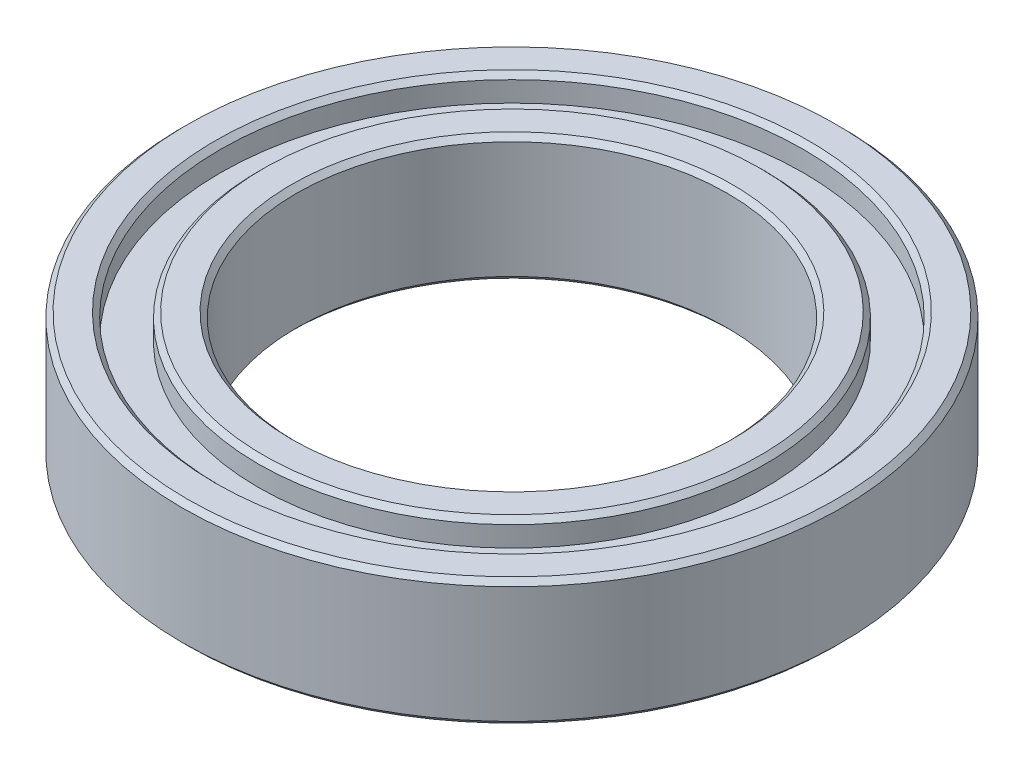
ISO-10303-21;
HEADER;
FILE_DESCRIPTION(('STEP AP214'),'2;1');
FILE_NAME('part.step','',(''),(''),'','','');
FILE_SCHEMA(('AUTOMOTIVE_DESIGN { 1 0 10303 214 1 1 1 1 }'));
ENDSEC;
DATA;
#1=APPLICATION_CONTEXT('core data for automotive mechanical design processes');
#2=APPLICATION_PROTOCOL_DEFINITION('international standard','automotive_design',2000,#1);
#3=PRODUCT_CONTEXT('',#1,'mechanical');
#4=PRODUCT('Part','Part','',(#3));
#5=PRODUCT_RELATED_PRODUCT_CATEGORY('part','',(#4));
#6=PRODUCT_DEFINITION_FORMATION('','',#4);
#7=PRODUCT_DEFINITION_CONTEXT('part definition',#1,'design');
#8=PRODUCT_DEFINITION('design','',#6,#7);
#9=PRODUCT_DEFINITION_SHAPE('','',#8);
#10=(LENGTH_UNIT() NAMED_UNIT(*) SI_UNIT(.MILLI.,.METRE.));
#11=(NAMED_UNIT(*) PLANE_ANGLE_UNIT() SI_UNIT($,.RADIAN.));
#12=(NAMED_UNIT(*) SI_UNIT($,.STERADIAN.) SOLID_ANGLE_UNIT());
#13=UNCERTAINTY_MEASURE_WITH_UNIT(LENGTH_MEASURE(1.E-05),#10,'distance_accuracy_value','');
#14=(GEOMETRIC_REPRESENTATION_CONTEXT(3) GLOBAL_UNCERTAINTY_ASSIGNED_CONTEXT((#13)) GLOBAL_UNIT_ASSIGNED_CONTEXT((#10,
#11,#12)) REPRESENTATION_CONTEXT('',''));
#15=CARTESIAN_POINT('',(0.,0.,0.));
#16=DIRECTION('',(0.,0.,1.));
#17=DIRECTION('',(1.,0.,0.));
#18=AXIS2_PLACEMENT_3D('',#15,#16,#17);
#19=CARTESIAN_POINT('',(0.,0.,0.));
#20=DIRECTION('',(0.,1.,0.));
#21=DIRECTION('',(0.,0.,1.));
#22=AXIS2_PLACEMENT_3D('',#19,#20,#21);
#23=PLANE('',#22);
#24=CARTESIAN_POINT('',(0.,0.,0.));
#25=DIRECTION('',(0.,1.,0.));
#26=DIRECTION('',(0.,0.,1.));
#27=AXIS2_PLACEMENT_3D('',#24,#25,#26);
#28=CIRCLE('',#27,9.80000000000001);
#29=CARTESIAN_POINT('',(0.,0.,9.80000000000001));
#30=VERTEX_POINT('',#29);
#31=EDGE_CURVE('E55',#30,#30,#28,.F.);
#32=ORIENTED_EDGE('',*,*,#31,.T.);
#33=EDGE_LOOP('',(#32));
#34=FACE_BOUND('',#33,.T.);
#35=CARTESIAN_POINT('',(0.,0.,0.));
#36=DIRECTION('',(0.,1.,0.));
#37=DIRECTION('',(0.,0.,1.));
#38=AXIS2_PLACEMENT_3D('',#35,#36,#37);
#39=CIRCLE('',#38,8.7);
#40=CARTESIAN_POINT('',(0.,0.,8.7));
#41=VERTEX_POINT('',#40);
#42=EDGE_CURVE('E59',#41,#41,#39,.T.);
#43=ORIENTED_EDGE('',*,*,#42,.T.);
#44=EDGE_LOOP('',(#43));
#45=FACE_BOUND('',#44,.T.);
#46=ADVANCED_FACE('F47',(#34,#45),#23,.F.);
#47=CARTESIAN_POINT('',(0.,5.,0.));
#48=DIRECTION('',(0.,1.,0.));
#49=DIRECTION('',(0.,0.,1.));
#50=AXIS2_PLACEMENT_3D('',#47,#48,#49);
#51=PLANE('',#50);
#52=CARTESIAN_POINT('',(0.,5.,0.));
#53=DIRECTION('',(0.,1.,0.));
#54=DIRECTION('',(0.,0.,1.));
#55=AXIS2_PLACEMENT_3D('',#52,#53,#54);
#56=CIRCLE('',#55,9.8);
#57=CARTESIAN_POINT('',(0.,5.,-9.8));
#58=VERTEX_POINT('',#57);
#59=EDGE_CURVE('E98',#58,#58,#56,.T.);
#60=ORIENTED_EDGE('',*,*,#59,.T.);
#61=EDGE_LOOP('',(#60));
#62=FACE_BOUND('',#61,.T.);
#63=CARTESIAN_POINT('',(0.,5.,0.));
#64=DIRECTION('',(0.,1.,0.));
#65=DIRECTION('',(0.,0.,1.));
#66=AXIS2_PLACEMENT_3D('',#63,#64,#65);
#67=CIRCLE('',#66,8.70000000000001);
#68=CARTESIAN_POINT('',(0.,5.,8.70000000000001));
#69=VERTEX_POINT('',#68);
#70=EDGE_CURVE('E101',#69,#69,#67,.F.);
#71=ORIENTED_EDGE('',*,*,#70,.T.);
#72=EDGE_LOOP('',(#71));
#73=FACE_BOUND('',#72,.T.);
#74=ADVANCED_FACE('F138',(#62,#73),#51,.T.);
#75=CARTESIAN_POINT('',(0.,5.,0.));
#76=DIRECTION('',(0.,1.,0.));
#77=DIRECTION('',(0.,0.,1.));
#78=AXIS2_PLACEMENT_3D('',#75,#76,#77);
#79=CIRCLE('',#78,12.8);
#80=CARTESIAN_POINT('',(0.,5.,12.8));
#81=VERTEX_POINT('',#80);
#82=EDGE_CURVE('E83',#81,#81,#79,.T.);
#83=ORIENTED_EDGE('',*,*,#82,.T.);
#84=EDGE_LOOP('',(#83));
#85=FACE_BOUND('',#84,.T.);
#86=CARTESIAN_POINT('',(0.,5.,0.));
#87=DIRECTION('',(0.,1.,0.));
#88=DIRECTION('',(0.,0.,1.));
#89=AXIS2_PLACEMENT_3D('',#86,#87,#88);
#90=CIRCLE('',#89,11.7);
#91=CARTESIAN_POINT('',(0.,5.,11.7));
#92=VERTEX_POINT('',#91);
#93=EDGE_CURVE('E86',#92,#92,#90,.F.);
#94=ORIENTED_EDGE('',*,*,#93,.T.);
#95=EDGE_LOOP('',(#94));
#96=FACE_BOUND('',#95,.T.);
#97=ADVANCED_FACE('F144',(#85,#96),#51,.T.);
#98=CARTESIAN_POINT('',(0.,0.,0.));
#99=DIRECTION('',(0.,1.,0.));
#100=DIRECTION('',(0.,0.,1.));
#101=AXIS2_PLACEMENT_3D('',#98,#99,#100);
#102=CIRCLE('',#101,12.8);
#103=CARTESIAN_POINT('',(0.,0.,12.8));
#104=VERTEX_POINT('',#103);
#105=EDGE_CURVE('E68',#104,#104,#102,.F.);
#106=ORIENTED_EDGE('',*,*,#105,.T.);
#107=EDGE_LOOP('',(#106));
#108=FACE_BOUND('',#107,.T.);
#109=CARTESIAN_POINT('',(0.,0.,0.));
#110=DIRECTION('',(0.,1.,0.));
#111=DIRECTION('',(0.,0.,1.));
#112=AXIS2_PLACEMENT_3D('',#109,#110,#111);
#113=CIRCLE('',#112,11.7);
#114=CARTESIAN_POINT('',(0.,0.,11.7));
#115=VERTEX_POINT('',#114);
#116=EDGE_CURVE('E71',#115,#115,#113,.T.);
#117=ORIENTED_EDGE('',*,*,#116,.T.);
#118=EDGE_LOOP('',(#117));
#119=FACE_BOUND('',#118,.T.);
#120=ADVANCED_FACE('F140',(#108,#119),#23,.F.);
#121=CARTESIAN_POINT('',(0.,5.,0.));
#122=DIRECTION('',(0.,-1.,0.));
#123=DIRECTION('',(0.,0.,-1.));
#124=AXIS2_PLACEMENT_3D('',#121,#122,#123);
#125=CYLINDRICAL_SURFACE('',#124,13.);
#126=CARTESIAN_POINT('',(0.,4.8,0.));
#127=DIRECTION('',(0.,1.,0.));
#128=DIRECTION('',(0.,0.,1.));
#129=AXIS2_PLACEMENT_3D('',#126,#127,#128);
#130=CIRCLE('',#129,13.);
#131=CARTESIAN_POINT('',(0.,4.8,13.));
#132=VERTEX_POINT('',#131);
#133=EDGE_CURVE('E77',#132,#132,#130,.F.);
#134=ORIENTED_EDGE('',*,*,#133,.T.);
#135=EDGE_LOOP('',(#134));
#136=FACE_BOUND('',#135,.T.);
#137=CARTESIAN_POINT('',(0.,0.199999999999997,0.));
#138=DIRECTION('',(0.,1.,0.));
#139=DIRECTION('',(0.,0.,1.));
#140=AXIS2_PLACEMENT_3D('',#137,#138,#139);
#141=CIRCLE('',#140,13.);
#142=CARTESIAN_POINT('',(0.,0.199999999999997,13.));
#143=VERTEX_POINT('',#142);
#144=EDGE_CURVE('E80',#143,#143,#141,.T.);
#145=ORIENTED_EDGE('',*,*,#144,.T.);
#146=EDGE_LOOP('',(#145));
#147=FACE_BOUND('',#146,.T.);
#148=ADVANCED_FACE('F150',(#136,#147),#125,.T.);
#149=CARTESIAN_POINT('',(0.,5.,0.));
#150=DIRECTION('',(0.,-1.,0.));
#151=DIRECTION('',(0.,0.,-1.));
#152=AXIS2_PLACEMENT_3D('',#149,#150,#151);
#153=CYLINDRICAL_SURFACE('',#152,8.5);
#154=CARTESIAN_POINT('',(0.,4.79999999999999,0.));
#155=DIRECTION('',(0.,1.,0.));
#156=DIRECTION('',(0.,0.,1.));
#157=AXIS2_PLACEMENT_3D('',#154,#155,#156);
#158=CIRCLE('',#157,8.5);
#159=CARTESIAN_POINT('',(0.,4.79999999999999,8.5));
#160=VERTEX_POINT('',#159);
#161=EDGE_CURVE('E89',#160,#160,#158,.T.);
#162=ORIENTED_EDGE('',*,*,#161,.T.);
#163=EDGE_LOOP('',(#162));
#164=FACE_BOUND('',#163,.T.);
#165=CARTESIAN_POINT('',(0.,0.200000000000001,0.));
#166=DIRECTION('',(0.,1.,0.));
#167=DIRECTION('',(0.,0.,1.));
#168=AXIS2_PLACEMENT_3D('',#165,#166,#167);
#169=CIRCLE('',#168,8.5);
#170=CARTESIAN_POINT('',(0.,0.200000000000001,8.5));
#171=VERTEX_POINT('',#170);
#172=EDGE_CURVE('E92',#171,#171,#169,.F.);
#173=ORIENTED_EDGE('',*,*,#172,.T.);
#174=EDGE_LOOP('',(#173));
#175=FACE_BOUND('',#174,.T.);
#176=ADVANCED_FACE('F156',(#164,#175),#153,.F.);
#177=CARTESIAN_POINT('',(0.,4.,0.));
#178=DIRECTION('',(0.,1.,0.));
#179=DIRECTION('',(0.,0.,1.));
#180=AXIS2_PLACEMENT_3D('',#177,#178,#179);
#181=CYLINDRICAL_SURFACE('',#180,11.5);
#182=CARTESIAN_POINT('',(0.,4.8,0.));
#183=DIRECTION('',(0.,1.,0.));
#184=DIRECTION('',(0.,0.,1.));
#185=AXIS2_PLACEMENT_3D('',#182,#183,#184);
#186=CIRCLE('',#185,11.5);
#187=CARTESIAN_POINT('',(0.,4.8,11.5));
#188=VERTEX_POINT('',#187);
#189=EDGE_CURVE('E74',#188,#188,#186,.T.);
#190=ORIENTED_EDGE('',*,*,#189,.T.);
#191=EDGE_LOOP('',(#190));
#192=FACE_BOUND('',#191,.T.);
#193=CARTESIAN_POINT('',(0.,4.,0.));
#194=DIRECTION('',(0.,1.,0.));
#195=DIRECTION('',(0.,0.,1.));
#196=AXIS2_PLACEMENT_3D('',#193,#194,#195);
#197=CIRCLE('',#196,11.5);
#198=CARTESIAN_POINT('',(0.,4.,11.5));
#199=VERTEX_POINT('',#198);
#200=EDGE_CURVE('E104',#199,#199,#197,.T.);
#201=ORIENTED_EDGE('',*,*,#200,.F.);
#202=EDGE_LOOP('',(#201));
#203=FACE_BOUND('',#202,.T.);
#204=ADVANCED_FACE('F229',(#192,#203),#181,.F.);
#205=CARTESIAN_POINT('',(0.,4.,0.));
#206=DIRECTION('',(0.,1.,0.));
#207=DIRECTION('',(0.,0.,1.));
#208=AXIS2_PLACEMENT_3D('',#205,#206,#207);
#209=PLANE('',#208);
#210=CARTESIAN_POINT('',(0.,4.,0.));
#211=DIRECTION('',(0.,1.,0.));
#212=DIRECTION('',(0.,0.,1.));
#213=AXIS2_PLACEMENT_3D('',#210,#211,#212);
#214=CIRCLE('',#213,10.);
#215=CARTESIAN_POINT('',(0.,4.,10.));
#216=VERTEX_POINT('',#215);
#217=EDGE_CURVE('E107',#216,#216,#214,.T.);
#218=ORIENTED_EDGE('',*,*,#217,.F.);
#219=EDGE_LOOP('',(#218));
#220=FACE_BOUND('',#219,.T.);
#221=ORIENTED_EDGE('',*,*,#200,.T.);
#222=EDGE_LOOP('',(#221));
#223=FACE_BOUND('',#222,.T.);
#224=ADVANCED_FACE('F134',(#220,#223),#209,.T.);
#225=CARTESIAN_POINT('',(0.,4.,0.));
#226=DIRECTION('',(0.,1.,0.));
#227=DIRECTION('',(0.,0.,1.));
#228=AXIS2_PLACEMENT_3D('',#225,#226,#227);
#229=CYLINDRICAL_SURFACE('',#228,10.);
#230=CARTESIAN_POINT('',(0.,4.80000000000001,0.));
#231=DIRECTION('',(0.,1.,0.));
#232=DIRECTION('',(0.,0.,1.));
#233=AXIS2_PLACEMENT_3D('',#230,#231,#232);
#234=CIRCLE('',#233,10.);
#235=CARTESIAN_POINT('',(0.,4.80000000000001,-10.));
#236=VERTEX_POINT('',#235);
#237=EDGE_CURVE('E95',#236,#236,#234,.F.);
#238=ORIENTED_EDGE('',*,*,#237,.T.);
#239=EDGE_LOOP('',(#238));
#240=FACE_BOUND('',#239,.T.);
#241=ORIENTED_EDGE('',*,*,#217,.T.);
#242=EDGE_LOOP('',(#241));
#243=FACE_BOUND('',#242,.T.);
#244=ADVANCED_FACE('F127',(#240,#243),#229,.T.);
#245=CARTESIAN_POINT('',(0.,1.,0.));
#246=DIRECTION('',(0.,-1.,0.));
#247=DIRECTION('',(0.,0.,-1.));
#248=AXIS2_PLACEMENT_3D('',#245,#246,#247);
#249=CYLINDRICAL_SURFACE('',#248,11.5);
#250=CARTESIAN_POINT('',(0.,0.200000000000001,0.));
#251=DIRECTION('',(0.,1.,0.));
#252=DIRECTION('',(0.,0.,1.));
#253=AXIS2_PLACEMENT_3D('',#250,#251,#252);
#254=CIRCLE('',#253,11.5);
#255=CARTESIAN_POINT('',(0.,0.200000000000001,11.5));
#256=VERTEX_POINT('',#255);
#257=EDGE_CURVE('E63',#256,#256,#254,.F.);
#258=ORIENTED_EDGE('',*,*,#257,.T.);
#259=EDGE_LOOP('',(#258));
#260=FACE_BOUND('',#259,.T.);
#261=CARTESIAN_POINT('',(0.,1.,0.));
#262=DIRECTION('',(0.,-1.,0.));
#263=DIRECTION('',(0.,0.,-1.));
#264=AXIS2_PLACEMENT_3D('',#261,#262,#263);
#265=CIRCLE('',#264,11.5);
#266=CARTESIAN_POINT('',(0.,1.,-11.5));
#267=VERTEX_POINT('',#266);
#268=EDGE_CURVE('E110',#267,#267,#265,.T.);
#269=ORIENTED_EDGE('',*,*,#268,.F.);
#270=EDGE_LOOP('',(#269));
#271=FACE_BOUND('',#270,.T.);
#272=ADVANCED_FACE('F122',(#260,#271),#249,.F.);
#273=CARTESIAN_POINT('',(0.,1.,0.));
#274=DIRECTION('',(0.,-1.,0.));
#275=DIRECTION('',(0.,0.,-1.));
#276=AXIS2_PLACEMENT_3D('',#273,#274,#275);
#277=PLANE('',#276);
#278=CARTESIAN_POINT('',(0.,1.,0.));
#279=DIRECTION('',(0.,-1.,0.));
#280=DIRECTION('',(0.,0.,-1.));
#281=AXIS2_PLACEMENT_3D('',#278,#279,#280);
#282=CIRCLE('',#281,10.);
#283=CARTESIAN_POINT('',(0.,1.,-10.));
#284=VERTEX_POINT('',#283);
#285=EDGE_CURVE('E113',#284,#284,#282,.T.);
#286=ORIENTED_EDGE('',*,*,#285,.F.);
#287=EDGE_LOOP('',(#286));
#288=FACE_BOUND('',#287,.T.);
#289=ORIENTED_EDGE('',*,*,#268,.T.);
#290=EDGE_LOOP('',(#289));
#291=FACE_BOUND('',#290,.T.);
#292=ADVANCED_FACE('F119',(#288,#291),#277,.T.);
#293=CARTESIAN_POINT('',(0.,1.,0.));
#294=DIRECTION('',(0.,-1.,0.));
#295=DIRECTION('',(0.,0.,-1.));
#296=AXIS2_PLACEMENT_3D('',#293,#294,#295);
#297=CYLINDRICAL_SURFACE('',#296,10.);
#298=CARTESIAN_POINT('',(0.,0.19999999999999,0.));
#299=DIRECTION('',(0.,1.,0.));
#300=DIRECTION('',(0.,0.,1.));
#301=AXIS2_PLACEMENT_3D('',#298,#299,#300);
#302=CIRCLE('',#301,10.);
#303=CARTESIAN_POINT('',(0.,0.19999999999999,10.));
#304=VERTEX_POINT('',#303);
#305=EDGE_CURVE('E10',#304,#304,#302,.T.);
#306=ORIENTED_EDGE('',*,*,#305,.T.);
#307=EDGE_LOOP('',(#306));
#308=FACE_BOUND('',#307,.T.);
#309=ORIENTED_EDGE('',*,*,#285,.T.);
#310=EDGE_LOOP('',(#309));
#311=FACE_BOUND('',#310,.T.);
#312=ADVANCED_FACE('F117',(#308,#311),#297,.T.);
#313=CARTESIAN_POINT('',(0.,5.,0.));
#314=DIRECTION('',(0.,-1.,0.));
#315=DIRECTION('',(0.,0.,-1.));
#316=AXIS2_PLACEMENT_3D('',#313,#314,#315);
#317=CONICAL_SURFACE('',#316,9.8,0.785398163397457);
#318=CARTESIAN_POINT('',(0.,4.80000000000001,-10.));
#319=CARTESIAN_POINT('',(0.,4.80208333333334,-9.99791666666667));
#320=CARTESIAN_POINT('',(0.,4.80416666666667,-9.99583333333333));
#321=CARTESIAN_POINT('',(0.,4.80833333333334,-9.99166666666667));
#322=CARTESIAN_POINT('',(0.,4.81041666666667,-9.98958333333333));
#323=CARTESIAN_POINT('',(0.,4.81458333333334,-9.98541666666667));
#324=CARTESIAN_POINT('',(0.,4.81666666666667,-9.98333333333333));
#325=CARTESIAN_POINT('',(0.,4.82083333333334,-9.97916666666667));
#326=CARTESIAN_POINT('',(0.,4.82291666666667,-9.97708333333333));
#327=CARTESIAN_POINT('',(0.,4.82708333333334,-9.97291666666667));
#328=CARTESIAN_POINT('',(0.,4.82916666666667,-9.97083333333333));
#329=CARTESIAN_POINT('',(0.,4.83333333333334,-9.96666666666667));
#330=CARTESIAN_POINT('',(0.,4.83541666666667,-9.96458333333333));
#331=CARTESIAN_POINT('',(0.,4.83958333333334,-9.96041666666667));
#332=CARTESIAN_POINT('',(0.,4.84166666666667,-9.95833333333333));
#333=CARTESIAN_POINT('',(0.,4.84583333333334,-9.95416666666667));
#334=CARTESIAN_POINT('',(0.,4.84791666666667,-9.95208333333333));
#335=CARTESIAN_POINT('',(0.,4.85208333333334,-9.94791666666667));
#336=CARTESIAN_POINT('',(0.,4.85416666666667,-9.94583333333333));
#337=CARTESIAN_POINT('',(0.,4.85833333333334,-9.94166666666667));
#338=CARTESIAN_POINT('',(0.,4.86041666666667,-9.93958333333333));
#339=CARTESIAN_POINT('',(0.,4.86458333333334,-9.93541666666667));
#340=CARTESIAN_POINT('',(0.,4.86666666666667,-9.93333333333333));
#341=CARTESIAN_POINT('',(0.,4.87083333333334,-9.92916666666667));
#342=CARTESIAN_POINT('',(0.,4.87291666666667,-9.92708333333333));
#343=CARTESIAN_POINT('',(0.,4.87708333333334,-9.92291666666667));
#344=CARTESIAN_POINT('',(0.,4.87916666666667,-9.92083333333334));
#345=CARTESIAN_POINT('',(0.,4.88333333333334,-9.91666666666667));
#346=CARTESIAN_POINT('',(0.,4.88541666666667,-9.91458333333333));
#347=CARTESIAN_POINT('',(0.,4.88958333333334,-9.91041666666667));
#348=CARTESIAN_POINT('',(0.,4.89166666666667,-9.90833333333333));
#349=CARTESIAN_POINT('',(0.,4.89583333333334,-9.90416666666667));
#350=CARTESIAN_POINT('',(0.,4.89791666666667,-9.90208333333334));
#351=CARTESIAN_POINT('',(0.,4.90208333333334,-9.89791666666667));
#352=CARTESIAN_POINT('',(0.,4.90416666666667,-9.89583333333333));
#353=CARTESIAN_POINT('',(0.,4.90833333333334,-9.89166666666667));
#354=CARTESIAN_POINT('',(0.,4.91041666666667,-9.88958333333334));
#355=CARTESIAN_POINT('',(0.,4.91458333333334,-9.88541666666667));
#356=CARTESIAN_POINT('',(0.,4.91666666666667,-9.88333333333334));
#357=CARTESIAN_POINT('',(0.,4.92083333333334,-9.87916666666667));
#358=CARTESIAN_POINT('',(0.,4.92291666666667,-9.87708333333333));
#359=CARTESIAN_POINT('',(0.,4.92708333333334,-9.87291666666667));
#360=CARTESIAN_POINT('',(0.,4.92916666666667,-9.87083333333334));
#361=CARTESIAN_POINT('',(0.,4.93333333333333,-9.86666666666667));
#362=CARTESIAN_POINT('',(0.,4.93541666666667,-9.86458333333334));
#363=CARTESIAN_POINT('',(0.,4.93958333333333,-9.86041666666667));
#364=CARTESIAN_POINT('',(0.,4.94166666666667,-9.85833333333334));
#365=CARTESIAN_POINT('',(0.,4.94583333333333,-9.85416666666667));
#366=CARTESIAN_POINT('',(0.,4.94791666666667,-9.85208333333334));
#367=CARTESIAN_POINT('',(0.,4.95208333333334,-9.84791666666667));
#368=CARTESIAN_POINT('',(0.,4.95416666666667,-9.84583333333334));
#369=CARTESIAN_POINT('',(0.,4.95833333333333,-9.84166666666667));
#370=CARTESIAN_POINT('',(0.,4.96041666666667,-9.83958333333334));
#371=CARTESIAN_POINT('',(0.,4.96458333333333,-9.83541666666667));
#372=CARTESIAN_POINT('',(0.,4.96666666666667,-9.83333333333334));
#373=CARTESIAN_POINT('',(0.,4.97083333333333,-9.82916666666667));
#374=CARTESIAN_POINT('',(0.,4.97291666666667,-9.82708333333334));
#375=CARTESIAN_POINT('',(0.,4.97708333333333,-9.82291666666667));
#376=CARTESIAN_POINT('',(0.,4.97916666666667,-9.82083333333334));
#377=CARTESIAN_POINT('',(0.,4.98333333333333,-9.81666666666667));
#378=CARTESIAN_POINT('',(0.,4.98541666666667,-9.81458333333334));
#379=CARTESIAN_POINT('',(0.,4.98958333333333,-9.81041666666667));
#380=CARTESIAN_POINT('',(0.,4.99166666666667,-9.80833333333334));
#381=CARTESIAN_POINT('',(0.,4.99583333333333,-9.80416666666667));
#382=CARTESIAN_POINT('',(0.,4.99791666666667,-9.80208333333334));
#383=CARTESIAN_POINT('',(0.,5.,-9.8));
#384=B_SPLINE_CURVE_WITH_KNOTS('',3,(#318,#319,#320,#321,#322,#323,#324,#325,#326,#327,#328,
#329,#330,#331,#332,#333,#334,#335,#336,#337,#338,#339,#340,#341,#342,#343,#344,#345,#346,#347,
#348,#349,#350,#351,#352,#353,#354,#355,#356,#357,#358,#359,#360,#361,#362,#363,#364,#365,#366,
#367,#368,#369,#370,#371,#372,#373,#374,#375,#376,#377,#378,#379,#380,#381,#382,#383),
.UNSPECIFIED.,.F.,.F.,(4,2,2,2,2,2,2,2,2,2,2,2,2,2,2,2,2,2,2,2,2,2,2,2,2,2,2,2,2,2,2,2,4),(0.,
0.00883883476483087,0.0176776695296624,0.0265165042944944,0.0353553390593259,0.0441941738241568,
0.0530330085889895,0.0618718433538204,0.0707106781186531,0.0795495128834846,0.0883883476483154,
0.0972271824131481,0.106066017177979,0.11490485194281,0.123743686707643,0.132582521472474,
0.141421356237306,0.150260191002138,0.159099025766969,0.1679378605318,0.176776695296633,
0.185615530061464,0.194454364826295,0.203293199591127,0.212132034355959,0.22097086912079,
0.229809703885622,0.238648538650454,0.247487373415285,0.256326208180117,0.265165042944948,
0.27400387770978,0.282842712474612),.UNSPECIFIED.);
#385=EDGE_CURVE('BSEAM210',#236,#58,#384,.T.);
#386=ORIENTED_EDGE('',*,*,#237,.F.);
#387=ORIENTED_EDGE('',*,*,#59,.F.);
#388=ORIENTED_EDGE('',*,*,#385,.T.);
#389=ORIENTED_EDGE('',*,*,#385,.F.);
#390=EDGE_LOOP('',(#386,#388,#387,#389));
#391=FACE_BOUND('',#390,.T.);
#392=ADVANCED_FACE('F210',(#391),#317,.T.);
#393=CARTESIAN_POINT('',(0.,4.79999999999999,0.));
#394=DIRECTION('',(0.,1.,0.));
#395=DIRECTION('',(0.,0.,1.));
#396=AXIS2_PLACEMENT_3D('',#393,#394,#395);
#397=CONICAL_SURFACE('',#396,8.5,0.785398163397457);
#398=ORIENTED_EDGE('',*,*,#70,.F.);
#399=EDGE_LOOP('',(#398));
#400=FACE_BOUND('',#399,.T.);
#401=ORIENTED_EDGE('',*,*,#161,.F.);
#402=EDGE_LOOP('',(#401));
#403=FACE_BOUND('',#402,.T.);
#404=ADVANCED_FACE('F203',(#400,#403),#397,.F.);
#405=CARTESIAN_POINT('',(0.,5.,0.));
#406=DIRECTION('',(0.,-1.,0.));
#407=DIRECTION('',(0.,0.,-1.));
#408=AXIS2_PLACEMENT_3D('',#405,#406,#407);
#409=CONICAL_SURFACE('',#408,12.8,0.785398163397461);
#410=ORIENTED_EDGE('',*,*,#133,.F.);
#411=EDGE_LOOP('',(#410));
#412=FACE_BOUND('',#411,.T.);
#413=ORIENTED_EDGE('',*,*,#82,.F.);
#414=EDGE_LOOP('',(#413));
#415=FACE_BOUND('',#414,.T.);
#416=ADVANCED_FACE('F196',(#412,#415),#409,.T.);
#417=CARTESIAN_POINT('',(0.,4.8,0.));
#418=DIRECTION('',(0.,1.,0.));
#419=DIRECTION('',(0.,0.,1.));
#420=AXIS2_PLACEMENT_3D('',#417,#418,#419);
#421=CONICAL_SURFACE('',#420,11.5,0.785398163397453);
#422=ORIENTED_EDGE('',*,*,#93,.F.);
#423=EDGE_LOOP('',(#422));
#424=FACE_BOUND('',#423,.T.);
#425=ORIENTED_EDGE('',*,*,#189,.F.);
#426=EDGE_LOOP('',(#425));
#427=FACE_BOUND('',#426,.T.);
#428=ADVANCED_FACE('F175',(#424,#427),#421,.F.);
#429=CARTESIAN_POINT('',(0.,0.199999999999997,0.));
#430=DIRECTION('',(0.,1.,0.));
#431=DIRECTION('',(0.,0.,1.));
#432=AXIS2_PLACEMENT_3D('',#429,#430,#431);
#433=CONICAL_SURFACE('',#432,13.,0.785398163397448);
#434=ORIENTED_EDGE('',*,*,#105,.F.);
#435=EDGE_LOOP('',(#434));
#436=FACE_BOUND('',#435,.T.);
#437=ORIENTED_EDGE('',*,*,#144,.F.);
#438=EDGE_LOOP('',(#437));
#439=FACE_BOUND('',#438,.T.);
#440=ADVANCED_FACE('F167',(#436,#439),#433,.T.);
#441=CARTESIAN_POINT('',(0.,0.200000000000001,0.));
#442=DIRECTION('',(0.,-1.,0.));
#443=DIRECTION('',(0.,0.,-1.));
#444=AXIS2_PLACEMENT_3D('',#441,#442,#443);
#445=CONICAL_SURFACE('',#444,11.5,0.785398163397453);
#446=ORIENTED_EDGE('',*,*,#116,.F.);
#447=EDGE_LOOP('',(#446));
#448=FACE_BOUND('',#447,.T.);
#449=ORIENTED_EDGE('',*,*,#257,.F.);
#450=EDGE_LOOP('',(#449));
#451=FACE_BOUND('',#450,.T.);
#452=ADVANCED_FACE('F163',(#448,#451),#445,.F.);
#453=CARTESIAN_POINT('',(0.,0.,0.));
#454=DIRECTION('',(0.,1.,0.));
#455=DIRECTION('',(0.,0.,1.));
#456=AXIS2_PLACEMENT_3D('',#453,#454,#455);
#457=CONICAL_SURFACE('',#456,9.80000000000001,0.785398163397448);
#458=ORIENTED_EDGE('',*,*,#305,.F.);
#459=EDGE_LOOP('',(#458));
#460=FACE_BOUND('',#459,.T.);
#461=ORIENTED_EDGE('',*,*,#31,.F.);
#462=EDGE_LOOP('',(#461));
#463=FACE_BOUND('',#462,.T.);
#464=ADVANCED_FACE('F166',(#460,#463),#457,.T.);
#465=CARTESIAN_POINT('',(0.,0.,0.));
#466=DIRECTION('',(0.,-1.,0.));
#467=DIRECTION('',(0.,0.,-1.));
#468=AXIS2_PLACEMENT_3D('',#465,#466,#467);
#469=CONICAL_SURFACE('',#468,8.7,0.785398163397444);
#470=ORIENTED_EDGE('',*,*,#172,.F.);
#471=EDGE_LOOP('',(#470));
#472=FACE_BOUND('',#471,.T.);
#473=ORIENTED_EDGE('',*,*,#42,.F.);
#474=EDGE_LOOP('',(#473));
#475=FACE_BOUND('',#474,.T.);
#476=ADVANCED_FACE('F50',(#472,#475),#469,.F.);
#477=CLOSED_SHELL('',(#46,#74,#97,#120,#148,#176,#204,#224,#244,#272,#292,#312,#392,#404,#416,
#428,#440,#452,#464,#476));
#478=MANIFOLD_SOLID_BREP('B2',#477);
#479=ADVANCED_BREP_SHAPE_REPRESENTATION('',(#18,#478),#14);
#480=SHAPE_DEFINITION_REPRESENTATION(#9,#479);
ENDSEC;
END-ISO-10303-21;
